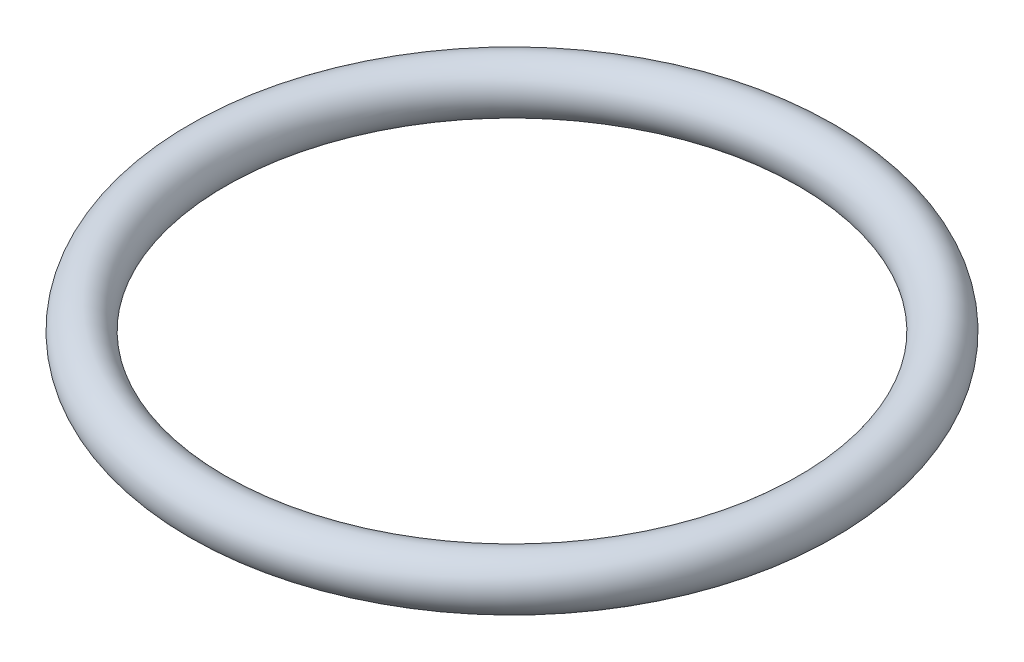
ISO-10303-21;
HEADER;
FILE_DESCRIPTION(('STEP AP214'),'2;1');
FILE_NAME('part.step','',(''),(''),'','','');
FILE_SCHEMA(('AUTOMOTIVE_DESIGN { 1 0 10303 214 1 1 1 1 }'));
ENDSEC;
DATA;
#1=APPLICATION_CONTEXT('core data for automotive mechanical design processes');
#2=APPLICATION_PROTOCOL_DEFINITION('international standard','automotive_design',2000,#1);
#3=PRODUCT_CONTEXT('',#1,'mechanical');
#4=PRODUCT('Part','Part','',(#3));
#5=PRODUCT_RELATED_PRODUCT_CATEGORY('part','',(#4));
#6=PRODUCT_DEFINITION_FORMATION('','',#4);
#7=PRODUCT_DEFINITION_CONTEXT('part definition',#1,'design');
#8=PRODUCT_DEFINITION('design','',#6,#7);
#9=PRODUCT_DEFINITION_SHAPE('','',#8);
#10=(LENGTH_UNIT() NAMED_UNIT(*) SI_UNIT(.MILLI.,.METRE.));
#11=(NAMED_UNIT(*) PLANE_ANGLE_UNIT() SI_UNIT($,.RADIAN.));
#12=(NAMED_UNIT(*) SI_UNIT($,.STERADIAN.) SOLID_ANGLE_UNIT());
#13=UNCERTAINTY_MEASURE_WITH_UNIT(LENGTH_MEASURE(1.E-05),#10,'distance_accuracy_value','');
#14=(GEOMETRIC_REPRESENTATION_CONTEXT(3) GLOBAL_UNCERTAINTY_ASSIGNED_CONTEXT((#13)) GLOBAL_UNIT_ASSIGNED_CONTEXT((#10,
#11,#12)) REPRESENTATION_CONTEXT('',''));
#15=CARTESIAN_POINT('',(0.,0.,0.));
#16=DIRECTION('',(0.,0.,1.));
#17=DIRECTION('',(1.,0.,0.));
#18=AXIS2_PLACEMENT_3D('',#15,#16,#17);
#19=CARTESIAN_POINT('',(0.,0.,0.));
#20=DIRECTION('',(0.,-1.,0.));
#21=DIRECTION('',(0.,0.,-1.));
#22=AXIS2_PLACEMENT_3D('',#19,#20,#21);
#23=TOROIDAL_SURFACE('',#22,30.25,2.5);
#24=CARTESIAN_POINT('',(0.,0.,-32.75));
#25=VERTEX_POINT('',#24);
#26=VERTEX_LOOP('',#25);
#27=FACE_BOUND('',#26,.T.);
#28=ADVANCED_FACE('F33',(#27),#23,.T.);
#29=CLOSED_SHELL('',(#28));
#30=MANIFOLD_SOLID_BREP('B2',#29);
#31=ADVANCED_BREP_SHAPE_REPRESENTATION('',(#18,#30),#14);
#32=SHAPE_DEFINITION_REPRESENTATION(#9,#31);
ENDSEC;
END-ISO-10303-21;
